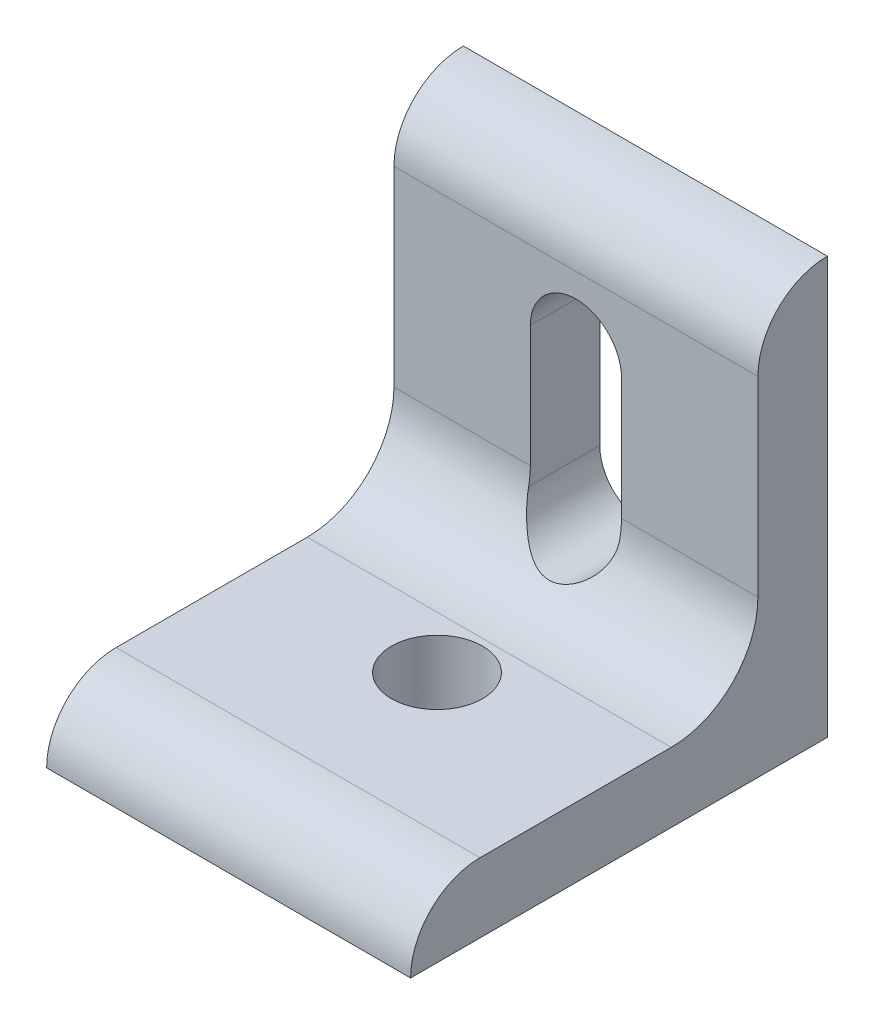
ISO-10303-21;
HEADER;
FILE_DESCRIPTION(('STEP AP214'),'2;1');
FILE_NAME('part.step','',(''),(''),'','','');
FILE_SCHEMA(('AUTOMOTIVE_DESIGN { 1 0 10303 214 1 1 1 1 }'));
ENDSEC;
DATA;
#1=APPLICATION_CONTEXT('core data for automotive mechanical design processes');
#2=APPLICATION_PROTOCOL_DEFINITION('international standard','automotive_design',2000,#1);
#3=PRODUCT_CONTEXT('',#1,'mechanical');
#4=PRODUCT('Part','Part','',(#3));
#5=PRODUCT_RELATED_PRODUCT_CATEGORY('part','',(#4));
#6=PRODUCT_DEFINITION_FORMATION('','',#4);
#7=PRODUCT_DEFINITION_CONTEXT('part definition',#1,'design');
#8=PRODUCT_DEFINITION('design','',#6,#7);
#9=PRODUCT_DEFINITION_SHAPE('','',#8);
#10=(LENGTH_UNIT() NAMED_UNIT(*) SI_UNIT(.MILLI.,.METRE.));
#11=(NAMED_UNIT(*) PLANE_ANGLE_UNIT() SI_UNIT($,.RADIAN.));
#12=(NAMED_UNIT(*) SI_UNIT($,.STERADIAN.) SOLID_ANGLE_UNIT());
#13=UNCERTAINTY_MEASURE_WITH_UNIT(LENGTH_MEASURE(1.E-05),#10,'distance_accuracy_value','');
#14=(GEOMETRIC_REPRESENTATION_CONTEXT(3) GLOBAL_UNCERTAINTY_ASSIGNED_CONTEXT((#13)) GLOBAL_UNIT_ASSIGNED_CONTEXT((#10,
#11,#12)) REPRESENTATION_CONTEXT('',''));
#15=CARTESIAN_POINT('',(0.,0.,0.));
#16=DIRECTION('',(0.,0.,1.));
#17=DIRECTION('',(1.,0.,0.));
#18=AXIS2_PLACEMENT_3D('',#15,#16,#17);
#19=CARTESIAN_POINT('',(16.637,0.,31.7500000000008));
#20=DIRECTION('',(-1.,0.,0.));
#21=DIRECTION('',(0.,0.,1.));
#22=AXIS2_PLACEMENT_3D('',#19,#20,#21);
#23=CYLINDRICAL_SURFACE('',#22,6.35);
#24=CARTESIAN_POINT('',(-16.637,0.,31.7500000000008));
#25=DIRECTION('',(-1.,0.,0.));
#26=DIRECTION('',(0.,0.,1.));
#27=AXIS2_PLACEMENT_3D('',#24,#25,#26);
#28=CIRCLE('',#27,6.35);
#29=CARTESIAN_POINT('',(-16.637,0.,38.1000000000008));
#30=VERTEX_POINT('',#29);
#31=CARTESIAN_POINT('',(-16.637,6.35,31.7500000000008));
#32=VERTEX_POINT('',#31);
#33=EDGE_CURVE('E157',#30,#32,#28,.T.);
#34=ORIENTED_EDGE('',*,*,#33,.F.);
#35=DIRECTION('',(-1.,0.,0.));
#36=VECTOR('',#35,1.);
#37=CARTESIAN_POINT('',(16.637,0.,38.1000000000008));
#38=LINE('',#37,#36);
#39=CARTESIAN_POINT('',(16.637,0.,38.1000000000008));
#40=VERTEX_POINT('',#39);
#41=EDGE_CURVE('E195',#40,#30,#38,.T.);
#42=ORIENTED_EDGE('',*,*,#41,.F.);
#43=CARTESIAN_POINT('',(16.637,0.,31.7500000000008));
#44=DIRECTION('',(-1.,0.,0.));
#45=DIRECTION('',(0.,0.,1.));
#46=AXIS2_PLACEMENT_3D('',#43,#44,#45);
#47=CIRCLE('',#46,6.35);
#48=CARTESIAN_POINT('',(16.637,6.35,31.7500000000008));
#49=VERTEX_POINT('',#48);
#50=EDGE_CURVE('E161',#40,#49,#47,.T.);
#51=ORIENTED_EDGE('',*,*,#50,.T.);
#52=DIRECTION('',(-1.,0.,0.));
#53=VECTOR('',#52,1.);
#54=CARTESIAN_POINT('',(16.637,6.35,31.7500000000008));
#55=LINE('',#54,#53);
#56=EDGE_CURVE('E179',#49,#32,#55,.T.);
#57=ORIENTED_EDGE('',*,*,#56,.T.);
#58=EDGE_LOOP('',(#34,#42,#51,#57));
#59=FACE_BOUND('',#58,.T.);
#60=ADVANCED_FACE('F33',(#59),#23,.T.);
#61=CARTESIAN_POINT('',(16.637,0.,0.));
#62=DIRECTION('',(0.,-1.,0.));
#63=DIRECTION('',(0.,0.,-1.));
#64=AXIS2_PLACEMENT_3D('',#61,#62,#63);
#65=PLANE('',#64);
#66=CARTESIAN_POINT('',(0.,0.,19.05));
#67=DIRECTION('',(0.,-1.,0.));
#68=DIRECTION('',(0.,0.,-1.));
#69=AXIS2_PLACEMENT_3D('',#66,#67,#68);
#70=CIRCLE('',#69,4.16559999999999);
#71=CARTESIAN_POINT('',(0.,0.,14.8844));
#72=VERTEX_POINT('',#71);
#73=EDGE_CURVE('E147',#72,#72,#70,.T.);
#74=ORIENTED_EDGE('',*,*,#73,.F.);
#75=EDGE_LOOP('',(#74));
#76=FACE_BOUND('',#75,.T.);
#77=DIRECTION('',(0.,0.,1.));
#78=VECTOR('',#77,1.);
#79=CARTESIAN_POINT('',(-16.637,0.,0.));
#80=LINE('',#79,#78);
#81=CARTESIAN_POINT('',(-16.637,0.,0.));
#82=VERTEX_POINT('',#81);
#83=EDGE_CURVE('E165',#82,#30,#80,.T.);
#84=ORIENTED_EDGE('',*,*,#83,.F.);
#85=DIRECTION('',(-1.,0.,0.));
#86=VECTOR('',#85,1.);
#87=CARTESIAN_POINT('',(16.637,0.,0.));
#88=LINE('',#87,#86);
#89=CARTESIAN_POINT('',(16.637,0.,0.));
#90=VERTEX_POINT('',#89);
#91=EDGE_CURVE('E198',#90,#82,#88,.T.);
#92=ORIENTED_EDGE('',*,*,#91,.F.);
#93=DIRECTION('',(0.,0.,1.));
#94=VECTOR('',#93,1.);
#95=CARTESIAN_POINT('',(16.637,0.,0.));
#96=LINE('',#95,#94);
#97=EDGE_CURVE('E176',#90,#40,#96,.T.);
#98=ORIENTED_EDGE('',*,*,#97,.T.);
#99=ORIENTED_EDGE('',*,*,#41,.T.);
#100=EDGE_LOOP('',(#84,#92,#98,#99));
#101=FACE_BOUND('',#100,.T.);
#102=ADVANCED_FACE('F238',(#76,#101),#65,.T.);
#103=CARTESIAN_POINT('',(16.637,38.1000000000008,0.));
#104=DIRECTION('',(0.,0.,-1.));
#105=DIRECTION('',(0.,1.,0.));
#106=AXIS2_PLACEMENT_3D('',#103,#104,#105);
#107=PLANE('',#106);
#108=CARTESIAN_POINT('',(0.,12.7000000000001,0.));
#109=DIRECTION('',(0.,0.,1.));
#110=DIRECTION('',(1.,0.,0.));
#111=AXIS2_PLACEMENT_3D('',#108,#109,#110);
#112=CIRCLE('',#111,4.1656);
#113=CARTESIAN_POINT('',(-4.1656,12.7000000000001,0.));
#114=VERTEX_POINT('',#113);
#115=CARTESIAN_POINT('',(4.1656,12.7000000000001,0.));
#116=VERTEX_POINT('',#115);
#117=EDGE_CURVE('E121',#114,#116,#112,.T.);
#118=ORIENTED_EDGE('',*,*,#117,.T.);
#119=DIRECTION('',(0.,1.,0.));
#120=VECTOR('',#119,1.);
#121=CARTESIAN_POINT('',(4.1656,12.7000000000001,0.));
#122=LINE('',#121,#120);
#123=CARTESIAN_POINT('',(4.1656,25.4000000000001,0.));
#124=VERTEX_POINT('',#123);
#125=EDGE_CURVE('E131',#116,#124,#122,.T.);
#126=ORIENTED_EDGE('',*,*,#125,.T.);
#127=CARTESIAN_POINT('',(0.,25.4000000000001,0.));
#128=DIRECTION('',(0.,0.,1.));
#129=DIRECTION('',(1.,0.,0.));
#130=AXIS2_PLACEMENT_3D('',#127,#128,#129);
#131=CIRCLE('',#130,4.1656);
#132=CARTESIAN_POINT('',(-4.1656,25.4000000000001,0.));
#133=VERTEX_POINT('',#132);
#134=EDGE_CURVE('E136',#124,#133,#131,.T.);
#135=ORIENTED_EDGE('',*,*,#134,.T.);
#136=DIRECTION('',(0.,-1.,0.));
#137=VECTOR('',#136,1.);
#138=CARTESIAN_POINT('',(-4.1656,25.4000000000001,0.));
#139=LINE('',#138,#137);
#140=EDGE_CURVE('E127',#133,#114,#139,.T.);
#141=ORIENTED_EDGE('',*,*,#140,.T.);
#142=EDGE_LOOP('',(#118,#126,#135,#141));
#143=FACE_BOUND('',#142,.T.);
#144=DIRECTION('',(0.,-1.,0.));
#145=VECTOR('',#144,1.);
#146=CARTESIAN_POINT('',(-16.637,38.1000000000008,0.));
#147=LINE('',#146,#145);
#148=CARTESIAN_POINT('',(-16.637,38.1000000000008,0.));
#149=VERTEX_POINT('',#148);
#150=EDGE_CURVE('E190',#149,#82,#147,.T.);
#151=ORIENTED_EDGE('',*,*,#150,.F.);
#152=DIRECTION('',(-1.,0.,0.));
#153=VECTOR('',#152,1.);
#154=CARTESIAN_POINT('',(16.637,38.1000000000008,0.));
#155=LINE('',#154,#153);
#156=CARTESIAN_POINT('',(16.637,38.1000000000008,0.));
#157=VERTEX_POINT('',#156);
#158=EDGE_CURVE('E200',#157,#149,#155,.T.);
#159=ORIENTED_EDGE('',*,*,#158,.F.);
#160=DIRECTION('',(0.,-1.,0.));
#161=VECTOR('',#160,1.);
#162=CARTESIAN_POINT('',(16.637,38.1000000000008,0.));
#163=LINE('',#162,#161);
#164=EDGE_CURVE('E173',#157,#90,#163,.T.);
#165=ORIENTED_EDGE('',*,*,#164,.T.);
#166=ORIENTED_EDGE('',*,*,#91,.T.);
#167=EDGE_LOOP('',(#151,#159,#165,#166));
#168=FACE_BOUND('',#167,.T.);
#169=ADVANCED_FACE('F138',(#143,#168),#107,.T.);
#170=CARTESIAN_POINT('',(16.637,31.7500000000008,0.));
#171=DIRECTION('',(-1.,0.,0.));
#172=DIRECTION('',(0.,0.,1.));
#173=AXIS2_PLACEMENT_3D('',#170,#171,#172);
#174=CYLINDRICAL_SURFACE('',#173,6.34999999999981);
#175=CARTESIAN_POINT('',(-16.637,31.7500000000008,0.));
#176=DIRECTION('',(-1.,0.,0.));
#177=DIRECTION('',(0.,0.,1.));
#178=AXIS2_PLACEMENT_3D('',#175,#176,#177);
#179=CIRCLE('',#178,6.34999999999981);
#180=CARTESIAN_POINT('',(-16.637,31.7500000000008,6.34999999999981));
#181=VERTEX_POINT('',#180);
#182=EDGE_CURVE('E187',#181,#149,#179,.T.);
#183=ORIENTED_EDGE('',*,*,#182,.F.);
#184=DIRECTION('',(-1.,0.,0.));
#185=VECTOR('',#184,1.);
#186=CARTESIAN_POINT('',(16.637,31.7500000000008,6.34999999999981));
#187=LINE('',#186,#185);
#188=CARTESIAN_POINT('',(16.637,31.7500000000008,6.34999999999981));
#189=VERTEX_POINT('',#188);
#190=EDGE_CURVE('E202',#189,#181,#187,.T.);
#191=ORIENTED_EDGE('',*,*,#190,.F.);
#192=CARTESIAN_POINT('',(16.637,31.7500000000008,0.));
#193=DIRECTION('',(-1.,0.,0.));
#194=DIRECTION('',(0.,0.,1.));
#195=AXIS2_PLACEMENT_3D('',#192,#193,#194);
#196=CIRCLE('',#195,6.34999999999981);
#197=EDGE_CURVE('E170',#189,#157,#196,.T.);
#198=ORIENTED_EDGE('',*,*,#197,.T.);
#199=ORIENTED_EDGE('',*,*,#158,.T.);
#200=EDGE_LOOP('',(#183,#191,#198,#199));
#201=FACE_BOUND('',#200,.T.);
#202=ADVANCED_FACE('F244',(#201),#174,.T.);
#203=CARTESIAN_POINT('',(16.637,6.35,6.35));
#204=DIRECTION('',(0.,0.,1.));
#205=DIRECTION('',(0.,-1.,0.));
#206=AXIS2_PLACEMENT_3D('',#203,#204,#205);
#207=PLANE('',#206);
#208=DIRECTION('',(0.,1.,0.));
#209=VECTOR('',#208,1.);
#210=CARTESIAN_POINT('',(-16.637,6.35,6.35));
#211=LINE('',#210,#209);
#212=CARTESIAN_POINT('',(-16.637,14.2747999999999,6.34999999999988));
#213=VERTEX_POINT('',#212);
#214=EDGE_CURVE('E185',#213,#181,#211,.T.);
#215=ORIENTED_EDGE('',*,*,#214,.F.);
#216=DIRECTION('',(-1.,0.,0.));
#217=VECTOR('',#216,1.);
#218=CARTESIAN_POINT('',(16.637,14.2747999999999,6.34999999999988));
#219=LINE('',#218,#217);
#220=CARTESIAN_POINT('',(-4.1656,14.2747999999999,6.3500000000001));
#221=VERTEX_POINT('',#220);
#222=EDGE_CURVE('E212',#213,#221,#219,.F.);
#223=ORIENTED_EDGE('',*,*,#222,.T.);
#224=DIRECTION('',(0.,-1.,0.));
#225=VECTOR('',#224,1.);
#226=CARTESIAN_POINT('',(-4.1656,25.4000000000001,6.3500000000001));
#227=LINE('',#226,#225);
#228=CARTESIAN_POINT('',(-4.1656,25.4000000000001,6.3500000000001));
#229=VERTEX_POINT('',#228);
#230=EDGE_CURVE('E141',#229,#221,#227,.T.);
#231=ORIENTED_EDGE('',*,*,#230,.F.);
#232=CARTESIAN_POINT('',(0.,25.4000000000001,6.3500000000001));
#233=DIRECTION('',(0.,0.,1.));
#234=DIRECTION('',(1.,0.,0.));
#235=AXIS2_PLACEMENT_3D('',#232,#233,#234);
#236=CIRCLE('',#235,4.1656);
#237=CARTESIAN_POINT('',(4.1656,25.4000000000001,6.3500000000001));
#238=VERTEX_POINT('',#237);
#239=EDGE_CURVE('E144',#238,#229,#236,.T.);
#240=ORIENTED_EDGE('',*,*,#239,.F.);
#241=DIRECTION('',(0.,1.,0.));
#242=VECTOR('',#241,1.);
#243=CARTESIAN_POINT('',(4.1656,12.7000000000001,6.3500000000001));
#244=LINE('',#243,#242);
#245=CARTESIAN_POINT('',(4.1656,14.2747999999999,6.3500000000001));
#246=VERTEX_POINT('',#245);
#247=EDGE_CURVE('E151',#246,#238,#244,.T.);
#248=ORIENTED_EDGE('',*,*,#247,.F.);
#249=DIRECTION('',(-1.,0.,0.));
#250=VECTOR('',#249,1.);
#251=CARTESIAN_POINT('',(16.637,14.2747999999999,6.34999999999988));
#252=LINE('',#251,#250);
#253=CARTESIAN_POINT('',(16.637,14.2747999999999,6.34999999999988));
#254=VERTEX_POINT('',#253);
#255=EDGE_CURVE('E210',#246,#254,#252,.F.);
#256=ORIENTED_EDGE('',*,*,#255,.T.);
#257=DIRECTION('',(0.,1.,0.));
#258=VECTOR('',#257,1.);
#259=CARTESIAN_POINT('',(16.637,6.35,6.35));
#260=LINE('',#259,#258);
#261=EDGE_CURVE('E168',#254,#189,#260,.T.);
#262=ORIENTED_EDGE('',*,*,#261,.T.);
#263=ORIENTED_EDGE('',*,*,#190,.T.);
#264=EDGE_LOOP('',(#215,#223,#231,#240,#248,#256,#262,#263));
#265=FACE_BOUND('',#264,.T.);
#266=ADVANCED_FACE('F247',(#265),#207,.T.);
#267=CARTESIAN_POINT('',(16.637,6.35,31.7500000000008));
#268=DIRECTION('',(0.,1.,0.));
#269=DIRECTION('',(0.,0.,1.));
#270=AXIS2_PLACEMENT_3D('',#267,#268,#269);
#271=PLANE('',#270);
#272=CARTESIAN_POINT('',(0.,6.35,19.05));
#273=DIRECTION('',(0.,1.,0.));
#274=DIRECTION('',(0.,0.,1.));
#275=AXIS2_PLACEMENT_3D('',#272,#273,#274);
#276=CIRCLE('',#275,4.16559999999998);
#277=CARTESIAN_POINT('',(0.,6.35,23.2156));
#278=VERTEX_POINT('',#277);
#279=EDGE_CURVE('E153',#278,#278,#276,.T.);
#280=ORIENTED_EDGE('',*,*,#279,.F.);
#281=EDGE_LOOP('',(#280));
#282=FACE_BOUND('',#281,.T.);
#283=DIRECTION('',(0.,0.,-1.));
#284=VECTOR('',#283,1.);
#285=CARTESIAN_POINT('',(16.637,6.35,31.7500000000008));
#286=LINE('',#285,#284);
#287=CARTESIAN_POINT('',(16.637,6.35,14.2747999999999));
#288=VERTEX_POINT('',#287);
#289=EDGE_CURVE('E164',#49,#288,#286,.T.);
#290=ORIENTED_EDGE('',*,*,#289,.T.);
#291=DIRECTION('',(-1.,0.,0.));
#292=VECTOR('',#291,1.);
#293=CARTESIAN_POINT('',(-16.637,6.35,14.2747999999999));
#294=LINE('',#293,#292);
#295=CARTESIAN_POINT('',(-16.637,6.35,14.2747999999999));
#296=VERTEX_POINT('',#295);
#297=EDGE_CURVE('E197',#288,#296,#294,.T.);
#298=ORIENTED_EDGE('',*,*,#297,.T.);
#299=DIRECTION('',(0.,0.,-1.));
#300=VECTOR('',#299,1.);
#301=CARTESIAN_POINT('',(-16.637,6.35,31.7500000000008));
#302=LINE('',#301,#300);
#303=EDGE_CURVE('E182',#32,#296,#302,.T.);
#304=ORIENTED_EDGE('',*,*,#303,.F.);
#305=ORIENTED_EDGE('',*,*,#56,.F.);
#306=EDGE_LOOP('',(#290,#298,#304,#305));
#307=FACE_BOUND('',#306,.T.);
#308=ADVANCED_FACE('F233',(#282,#307),#271,.T.);
#309=CARTESIAN_POINT('',(16.637,0.,31.7500000000008));
#310=DIRECTION('',(-1.,0.,0.));
#311=DIRECTION('',(0.,0.,1.));
#312=AXIS2_PLACEMENT_3D('',#309,#310,#311);
#313=PLANE('',#312);
#314=ORIENTED_EDGE('',*,*,#50,.F.);
#315=ORIENTED_EDGE('',*,*,#97,.F.);
#316=ORIENTED_EDGE('',*,*,#164,.F.);
#317=ORIENTED_EDGE('',*,*,#197,.F.);
#318=ORIENTED_EDGE('',*,*,#261,.F.);
#319=CARTESIAN_POINT('',(16.637,14.2748,14.2747999999999));
#320=DIRECTION('',(-1.,0.,0.));
#321=DIRECTION('',(0.,0.,1.));
#322=AXIS2_PLACEMENT_3D('',#319,#320,#321);
#323=CIRCLE('',#322,7.9248);
#324=EDGE_CURVE('E11',#254,#288,#323,.T.);
#325=ORIENTED_EDGE('',*,*,#324,.T.);
#326=ORIENTED_EDGE('',*,*,#289,.F.);
#327=EDGE_LOOP('',(#314,#315,#316,#317,#318,#325,#326));
#328=FACE_BOUND('',#327,.T.);
#329=ADVANCED_FACE('F230',(#328),#313,.F.);
#330=CARTESIAN_POINT('',(-16.637,0.,31.7500000000008));
#331=DIRECTION('',(-1.,0.,0.));
#332=DIRECTION('',(0.,0.,1.));
#333=AXIS2_PLACEMENT_3D('',#330,#331,#332);
#334=PLANE('',#333);
#335=ORIENTED_EDGE('',*,*,#33,.T.);
#336=ORIENTED_EDGE('',*,*,#303,.T.);
#337=CARTESIAN_POINT('',(-16.637,14.2748,14.2747999999999));
#338=DIRECTION('',(-1.,0.,0.));
#339=DIRECTION('',(0.,0.,1.));
#340=AXIS2_PLACEMENT_3D('',#337,#338,#339);
#341=CIRCLE('',#340,7.9248);
#342=EDGE_CURVE('E214',#296,#213,#341,.F.);
#343=ORIENTED_EDGE('',*,*,#342,.T.);
#344=ORIENTED_EDGE('',*,*,#214,.T.);
#345=ORIENTED_EDGE('',*,*,#182,.T.);
#346=ORIENTED_EDGE('',*,*,#150,.T.);
#347=ORIENTED_EDGE('',*,*,#83,.T.);
#348=EDGE_LOOP('',(#335,#336,#343,#344,#345,#346,#347));
#349=FACE_BOUND('',#348,.T.);
#350=ADVANCED_FACE('F228',(#349),#334,.T.);
#351=CARTESIAN_POINT('',(0.,12.7000000000001,0.));
#352=DIRECTION('',(0.,0.,1.));
#353=DIRECTION('',(1.,0.,0.));
#354=AXIS2_PLACEMENT_3D('',#351,#352,#353);
#355=CYLINDRICAL_SURFACE('',#354,4.1656);
#356=DIRECTION('',(0.,0.,1.));
#357=VECTOR('',#356,1.);
#358=CARTESIAN_POINT('',(-4.1656,12.7000000000001,0.));
#359=LINE('',#358,#357);
#360=CARTESIAN_POINT('',(-4.1656,12.7000000000001,6.50804649547817));
#361=VERTEX_POINT('',#360);
#362=EDGE_CURVE('E56',#114,#361,#359,.T.);
#363=ORIENTED_EDGE('',*,*,#362,.T.);
#364=CARTESIAN_POINT('',(-4.1656,12.7000000000001,6.50804649547817));
#365=CARTESIAN_POINT('',(-4.16561740535238,12.5835580765925,6.53163220274436));
#366=CARTESIAN_POINT('',(-4.16071876942945,12.4676933434239,6.55787464961555));
#367=CARTESIAN_POINT('',(-4.14150664543221,12.2380828578919,6.61528756573004));
#368=CARTESIAN_POINT('',(-4.12720117520229,12.1243353857247,6.64645382103014));
#369=CARTESIAN_POINT('',(-4.08971516347229,11.900462902073,6.71314980276575));
#370=CARTESIAN_POINT('',(-4.06659372747526,11.7903189589892,6.74864942173945));
#371=CARTESIAN_POINT('',(-4.0119644114413,11.5735592761763,6.82369749415298));
#372=CARTESIAN_POINT('',(-3.98045493441524,11.4669442126568,6.86324671770893));
#373=CARTESIAN_POINT('',(-3.87432865818805,11.1539873654592,6.98693094869227));
#374=CARTESIAN_POINT('',(-3.78795143881343,10.9536021930046,7.07638533753289));
#375=CARTESIAN_POINT('',(-3.58750983105808,10.5719346004299,7.26503543245164));
#376=CARTESIAN_POINT('',(-3.47338876021334,10.3906923921383,7.36425083064576));
#377=CARTESIAN_POINT('',(-3.20493418980411,10.0283860031618,7.58001868893731));
#378=CARTESIAN_POINT('',(-3.04738262722771,9.85008010781661,7.69720346524839));
#379=CARTESIAN_POINT('',(-2.70373754837416,9.52219145004712,7.93007233129094));
#380=CARTESIAN_POINT('',(-2.51764160964142,9.37261112788451,8.04575629274922));
#381=CARTESIAN_POINT('',(-2.14977251920148,9.12625896600265,8.24850232099284));
#382=CARTESIAN_POINT('',(-1.9719949281517,9.02487422813003,8.33719389505664));
#383=CARTESIAN_POINT('',(-1.59767764113759,8.84742149049874,8.49895258090911));
#384=CARTESIAN_POINT('',(-1.40117380436338,8.77130630738454,8.57204872023751));
#385=CARTESIAN_POINT('',(-1.03748745676759,8.66225688177187,8.67959197113009));
#386=CARTESIAN_POINT('',(-0.873562635560926,8.62347457603918,8.71902533273072));
#387=CARTESIAN_POINT('',(-0.538824344087057,8.56591907001305,8.77817530674117));
#388=CARTESIAN_POINT('',(-0.36802062133759,8.54711852353138,8.79791886349307));
#389=CARTESIAN_POINT('',(-0.0235525068247892,8.53088867576551,8.81493669321491));
#390=CARTESIAN_POINT('',(0.150120484464335,8.53354358502675,8.81212242931847));
#391=CARTESIAN_POINT('',(0.494041966253781,8.56019683034557,8.78425424330855));
#392=CARTESIAN_POINT('',(0.664287346324122,8.58421373123506,8.75918097684391));
#393=CARTESIAN_POINT('',(1.02601276038825,8.65780369031974,8.68418406210548));
#394=CARTESIAN_POINT('',(1.21595856593891,8.71112980332622,8.63066424196036));
#395=CARTESIAN_POINT('',(1.58127370392624,8.84129823674268,8.50525849196919));
#396=CARTESIAN_POINT('',(1.75661223077301,8.91818873177579,8.43333498813327));
#397=CARTESIAN_POINT('',(2.03592724447353,9.06363018103859,8.30384494130234));
#398=CARTESIAN_POINT('',(2.14436787754789,9.12656845323007,8.24936632169085));
#399=CARTESIAN_POINT('',(2.35395380195968,9.26101430957063,8.13704224540892));
#400=CARTESIAN_POINT('',(2.45509920771462,9.33252175927489,8.07919684156846));
#401=CARTESIAN_POINT('',(2.65009049694287,9.48371552093102,7.96154748114279));
#402=CARTESIAN_POINT('',(2.74392662870051,9.56341244113352,7.90174105435623));
#403=CARTESIAN_POINT('',(2.9239792275622,9.730546562835,7.78151020507372));
#404=CARTESIAN_POINT('',(3.01019638409213,9.81798306255873,7.72108583904705));
#405=CARTESIAN_POINT('',(3.17609532271027,10.0018115278445,7.59974547611735));
#406=CARTESIAN_POINT('',(3.25564621844666,10.0983271819744,7.53883775067387));
#407=CARTESIAN_POINT('',(3.40616443361773,10.2987564408495,7.41862125240671));
#408=CARTESIAN_POINT('',(3.47713259518091,10.4026693181953,7.35931232315537));
#409=CARTESIAN_POINT('',(3.60974590493584,10.6172568575749,7.24346608950326));
#410=CARTESIAN_POINT('',(3.67141704343746,10.7279114076558,7.18692136875608));
#411=CARTESIAN_POINT('',(3.7850025176819,10.9558134721984,7.07738622979645));
#412=CARTESIAN_POINT('',(3.83691691598772,11.073060944378,7.02439578879435));
#413=CARTESIAN_POINT('',(3.92858917841974,11.3093524254137,6.92466825089209));
#414=CARTESIAN_POINT('',(3.9687080223185,11.4281909862076,6.87777747044391));
#415=CARTESIAN_POINT('',(4.03839853103679,11.670692309647,6.78896300700533));
#416=CARTESIAN_POINT('',(4.06797349275737,11.7943535508776,6.74703777411168));
#417=CARTESIAN_POINT('',(4.11607493407713,12.0467219375615,6.66850733292098));
#418=CARTESIAN_POINT('',(4.13450150587616,12.1754640074442,6.6319523922342));
#419=CARTESIAN_POINT('',(4.15928635187595,12.4358810439195,6.56512440811807));
#420=CARTESIAN_POINT('',(4.16562889765032,12.5675596075261,6.53485959740597));
#421=CARTESIAN_POINT('',(4.1656,12.7000000000001,6.50804649547817));
#422=B_SPLINE_CURVE_WITH_KNOTS('',3,(#364,#365,#366,#367,#368,#369,#370,#371,#372,#373,#374,
#375,#376,#377,#378,#379,#380,#381,#382,#383,#384,#385,#386,#387,#388,#389,#390,#391,#392,#393,
#394,#395,#396,#397,#398,#399,#400,#401,#402,#403,#404,#405,#406,#407,#408,#409,#410,#411,#412,
#413,#414,#415,#416,#417,#418,#419,#420,#421),.UNSPECIFIED.,.F.,.F.,(4,2,2,2,2,2,2,2,2,2,2,2,2,
2,2,2,2,2,2,2,2,2,2,2,2,2,2,2,4),(0.,0.356230564600406,0.712157891644701,1.06573975483689,
1.41938898426376,2.12376165412192,2.82958567821202,3.62213731146312,4.41475624289141,
5.08166429224452,5.74731999275768,6.26425629437069,6.78048422431449,7.29873927905101,
7.81744516857058,8.42741656536719,9.03864339127072,9.44829000204647,9.85793018657469,
10.2681078534863,10.6782483661516,11.0951378285751,11.5119863530162,11.9276470386122,
12.3433050587822,12.7444590989697,13.145487594549,13.5500586889426,13.9551560095349),.UNSPECIFIED.);
#423=CARTESIAN_POINT('',(4.1656,12.7000000000001,6.50804649547817));
#424=VERTEX_POINT('',#423);
#425=EDGE_CURVE('E124',#361,#424,#422,.T.);
#426=ORIENTED_EDGE('',*,*,#425,.T.);
#427=DIRECTION('',(0.,0.,1.));
#428=VECTOR('',#427,1.);
#429=CARTESIAN_POINT('',(4.1656,12.7000000000001,0.));
#430=LINE('',#429,#428);
#431=EDGE_CURVE('E49',#116,#424,#430,.T.);
#432=ORIENTED_EDGE('',*,*,#431,.F.);
#433=ORIENTED_EDGE('',*,*,#117,.F.);
#434=EDGE_LOOP('',(#363,#426,#432,#433));
#435=FACE_BOUND('',#434,.T.);
#436=ADVANCED_FACE('F119',(#435),#355,.F.);
#437=CARTESIAN_POINT('',(-4.1656,25.4000000000001,0.));
#438=DIRECTION('',(-1.,0.,0.));
#439=DIRECTION('',(0.,-1.,0.));
#440=AXIS2_PLACEMENT_3D('',#437,#438,#439);
#441=PLANE('',#440);
#442=ORIENTED_EDGE('',*,*,#230,.T.);
#443=CARTESIAN_POINT('',(-4.1656,14.2748,14.2747999999999));
#444=DIRECTION('',(-1.,0.,0.));
#445=DIRECTION('',(0.,-1.,0.));
#446=AXIS2_PLACEMENT_3D('',#443,#444,#445);
#447=CIRCLE('',#446,7.9248);
#448=EDGE_CURVE('E216',#221,#361,#447,.T.);
#449=ORIENTED_EDGE('',*,*,#448,.T.);
#450=ORIENTED_EDGE('',*,*,#362,.F.);
#451=ORIENTED_EDGE('',*,*,#140,.F.);
#452=DIRECTION('',(0.,0.,1.));
#453=VECTOR('',#452,1.);
#454=CARTESIAN_POINT('',(-4.1656,25.4000000000001,0.));
#455=LINE('',#454,#453);
#456=EDGE_CURVE('E158',#133,#229,#455,.T.);
#457=ORIENTED_EDGE('',*,*,#456,.T.);
#458=EDGE_LOOP('',(#442,#449,#450,#451,#457));
#459=FACE_BOUND('',#458,.T.);
#460=ADVANCED_FACE('F227',(#459),#441,.F.);
#461=CARTESIAN_POINT('',(0.,25.4000000000001,0.));
#462=DIRECTION('',(0.,0.,1.));
#463=DIRECTION('',(1.,0.,0.));
#464=AXIS2_PLACEMENT_3D('',#461,#462,#463);
#465=CYLINDRICAL_SURFACE('',#464,4.1656);
#466=ORIENTED_EDGE('',*,*,#239,.T.);
#467=ORIENTED_EDGE('',*,*,#456,.F.);
#468=ORIENTED_EDGE('',*,*,#134,.F.);
#469=DIRECTION('',(0.,0.,1.));
#470=VECTOR('',#469,1.);
#471=CARTESIAN_POINT('',(4.1656,25.4000000000001,0.));
#472=LINE('',#471,#470);
#473=EDGE_CURVE('E126',#124,#238,#472,.T.);
#474=ORIENTED_EDGE('',*,*,#473,.T.);
#475=EDGE_LOOP('',(#466,#467,#468,#474));
#476=FACE_BOUND('',#475,.T.);
#477=ADVANCED_FACE('F283',(#476),#465,.F.);
#478=CARTESIAN_POINT('',(4.1656,12.7000000000001,0.));
#479=DIRECTION('',(1.,0.,0.));
#480=DIRECTION('',(0.,0.,-1.));
#481=AXIS2_PLACEMENT_3D('',#478,#479,#480);
#482=PLANE('',#481);
#483=ORIENTED_EDGE('',*,*,#431,.T.);
#484=CARTESIAN_POINT('',(4.1656,14.2748,14.2747999999999));
#485=DIRECTION('',(1.,0.,0.));
#486=DIRECTION('',(0.,0.,-1.));
#487=AXIS2_PLACEMENT_3D('',#484,#485,#486);
#488=CIRCLE('',#487,7.9248);
#489=EDGE_CURVE('E42',#424,#246,#488,.T.);
#490=ORIENTED_EDGE('',*,*,#489,.T.);
#491=ORIENTED_EDGE('',*,*,#247,.T.);
#492=ORIENTED_EDGE('',*,*,#473,.F.);
#493=ORIENTED_EDGE('',*,*,#125,.F.);
#494=EDGE_LOOP('',(#483,#490,#491,#492,#493));
#495=FACE_BOUND('',#494,.T.);
#496=ADVANCED_FACE('F132',(#495),#482,.F.);
#497=CARTESIAN_POINT('',(0.,0.,19.05));
#498=DIRECTION('',(0.,-1.,0.));
#499=DIRECTION('',(0.,0.,-1.));
#500=AXIS2_PLACEMENT_3D('',#497,#498,#499);
#501=CYLINDRICAL_SURFACE('',#500,4.16559999999998);
#502=ORIENTED_EDGE('',*,*,#279,.T.);
#503=EDGE_LOOP('',(#502));
#504=FACE_BOUND('',#503,.T.);
#505=ORIENTED_EDGE('',*,*,#73,.T.);
#506=EDGE_LOOP('',(#505));
#507=FACE_BOUND('',#506,.T.);
#508=ADVANCED_FACE('F291',(#504,#507),#501,.F.);
#509=CARTESIAN_POINT('',(16.637,14.2748,14.2747999999999));
#510=DIRECTION('',(1.,0.,0.));
#511=DIRECTION('',(0.,0.,-1.));
#512=AXIS2_PLACEMENT_3D('',#509,#510,#511);
#513=CYLINDRICAL_SURFACE('',#512,7.9248);
#514=ORIENTED_EDGE('',*,*,#448,.F.);
#515=ORIENTED_EDGE('',*,*,#222,.F.);
#516=ORIENTED_EDGE('',*,*,#342,.F.);
#517=ORIENTED_EDGE('',*,*,#297,.F.);
#518=ORIENTED_EDGE('',*,*,#324,.F.);
#519=ORIENTED_EDGE('',*,*,#255,.F.);
#520=ORIENTED_EDGE('',*,*,#489,.F.);
#521=ORIENTED_EDGE('',*,*,#425,.F.);
#522=EDGE_LOOP('',(#514,#515,#516,#517,#518,#519,#520,#521));
#523=FACE_BOUND('',#522,.T.);
#524=ADVANCED_FACE('F35',(#523),#513,.F.);
#525=CLOSED_SHELL('',(#60,#102,#169,#202,#266,#308,#329,#350,#436,#460,#477,#496,#508,#524));
#526=MANIFOLD_SOLID_BREP('B2',#525);
#527=ADVANCED_BREP_SHAPE_REPRESENTATION('',(#18,#526),#14);
#528=SHAPE_DEFINITION_REPRESENTATION(#9,#527);
ENDSEC;
END-ISO-10303-21;
